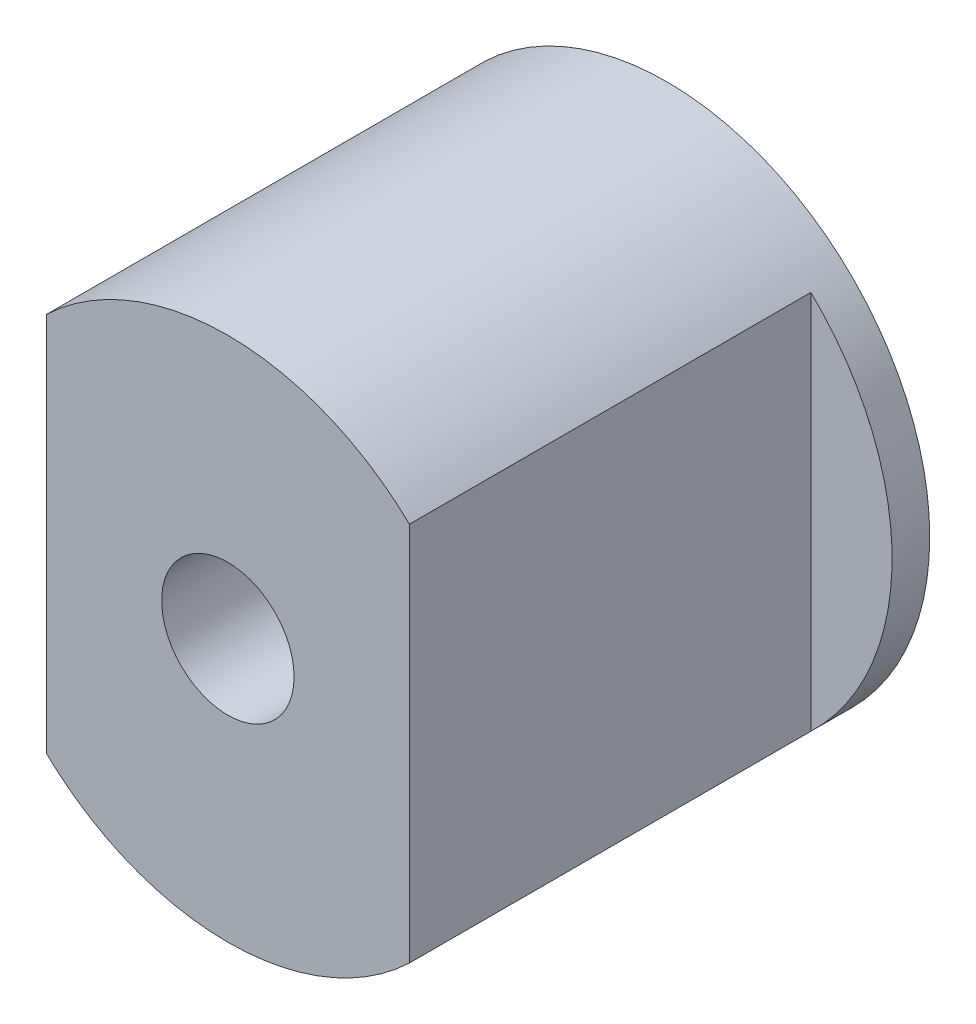
ISO-10303-21;
HEADER;
FILE_DESCRIPTION(('STEP AP214'),'2;1');
FILE_NAME('part.step','',(''),(''),'','','');
FILE_SCHEMA(('AUTOMOTIVE_DESIGN { 1 0 10303 214 1 1 1 1 }'));
ENDSEC;
DATA;
#1=APPLICATION_CONTEXT('core data for automotive mechanical design processes');
#2=APPLICATION_PROTOCOL_DEFINITION('international standard','automotive_design',2000,#1);
#3=PRODUCT_CONTEXT('',#1,'mechanical');
#4=PRODUCT('Part','Part','',(#3));
#5=PRODUCT_RELATED_PRODUCT_CATEGORY('part','',(#4));
#6=PRODUCT_DEFINITION_FORMATION('','',#4);
#7=PRODUCT_DEFINITION_CONTEXT('part definition',#1,'design');
#8=PRODUCT_DEFINITION('design','',#6,#7);
#9=PRODUCT_DEFINITION_SHAPE('','',#8);
#10=(LENGTH_UNIT() NAMED_UNIT(*) SI_UNIT(.MILLI.,.METRE.));
#11=(NAMED_UNIT(*) PLANE_ANGLE_UNIT() SI_UNIT($,.RADIAN.));
#12=(NAMED_UNIT(*) SI_UNIT($,.STERADIAN.) SOLID_ANGLE_UNIT());
#13=UNCERTAINTY_MEASURE_WITH_UNIT(LENGTH_MEASURE(1.E-05),#10,'distance_accuracy_value','');
#14=(GEOMETRIC_REPRESENTATION_CONTEXT(3) GLOBAL_UNCERTAINTY_ASSIGNED_CONTEXT((#13)) GLOBAL_UNIT_ASSIGNED_CONTEXT((#10,
#11,#12)) REPRESENTATION_CONTEXT('',''));
#15=CARTESIAN_POINT('',(0.,0.,0.));
#16=DIRECTION('',(0.,0.,1.));
#17=DIRECTION('',(1.,0.,0.));
#18=AXIS2_PLACEMENT_3D('',#15,#16,#17);
#19=CARTESIAN_POINT('',(0.,0.,0.5));
#20=DIRECTION('',(0.,0.,1.));
#21=DIRECTION('',(1.,0.,0.));
#22=AXIS2_PLACEMENT_3D('',#19,#20,#21);
#23=PLANE('',#22);
#24=DIRECTION('',(0.,-1.,0.));
#25=VECTOR('',#24,1.);
#26=CARTESIAN_POINT('',(-2.413,-2.52487370971302,0.5));
#27=LINE('',#26,#25);
#28=CARTESIAN_POINT('',(-2.413,2.52487370971302,0.5));
#29=VERTEX_POINT('',#28);
#30=CARTESIAN_POINT('',(-2.413,-2.52487370971302,0.5));
#31=VERTEX_POINT('',#30);
#32=EDGE_CURVE('E84',#29,#31,#27,.T.);
#33=ORIENTED_EDGE('',*,*,#32,.F.);
#34=CARTESIAN_POINT('',(0.,0.,0.5));
#35=DIRECTION('',(0.,0.,1.));
#36=DIRECTION('',(1.,0.,0.));
#37=AXIS2_PLACEMENT_3D('',#34,#35,#36);
#38=CIRCLE('',#37,3.4925);
#39=EDGE_CURVE('E11',#29,#31,#38,.T.);
#40=ORIENTED_EDGE('',*,*,#39,.T.);
#41=EDGE_LOOP('',(#33,#40));
#42=FACE_BOUND('',#41,.T.);
#43=ADVANCED_FACE('F33',(#42),#23,.T.);
#44=CARTESIAN_POINT('',(0.,0.,0.5));
#45=DIRECTION('',(0.,0.,-1.));
#46=DIRECTION('',(-1.,0.,0.));
#47=AXIS2_PLACEMENT_3D('',#44,#45,#46);
#48=CYLINDRICAL_SURFACE('',#47,3.4925);
#49=ORIENTED_EDGE('',*,*,#39,.F.);
#50=DIRECTION('',(0.,0.,-1.));
#51=VECTOR('',#50,1.);
#52=CARTESIAN_POINT('',(-2.413,2.52487370971302,5.834));
#53=LINE('',#52,#51);
#54=CARTESIAN_POINT('',(-2.413,2.52487370971302,5.834));
#55=VERTEX_POINT('',#54);
#56=EDGE_CURVE('E90',#55,#29,#53,.T.);
#57=ORIENTED_EDGE('',*,*,#56,.F.);
#58=CARTESIAN_POINT('',(0.,0.,5.834));
#59=DIRECTION('',(0.,0.,1.));
#60=DIRECTION('',(1.,0.,0.));
#61=AXIS2_PLACEMENT_3D('',#58,#59,#60);
#62=CIRCLE('',#61,3.4925);
#63=CARTESIAN_POINT('',(2.413,2.52487370971302,5.834));
#64=VERTEX_POINT('',#63);
#65=EDGE_CURVE('E89',#64,#55,#62,.T.);
#66=ORIENTED_EDGE('',*,*,#65,.F.);
#67=DIRECTION('',(0.,0.,-1.));
#68=VECTOR('',#67,1.);
#69=CARTESIAN_POINT('',(2.413,2.52487370971302,5.834));
#70=LINE('',#69,#68);
#71=CARTESIAN_POINT('',(2.413,2.52487370971302,0.5));
#72=VERTEX_POINT('',#71);
#73=EDGE_CURVE('E81',#64,#72,#70,.T.);
#74=ORIENTED_EDGE('',*,*,#73,.T.);
#75=CARTESIAN_POINT('',(2.413,-2.52487370971302,0.5));
#76=VERTEX_POINT('',#75);
#77=EDGE_CURVE('E42',#76,#72,#38,.T.);
#78=ORIENTED_EDGE('',*,*,#77,.F.);
#79=DIRECTION('',(0.,0.,-1.));
#80=VECTOR('',#79,1.);
#81=CARTESIAN_POINT('',(2.413,-2.52487370971302,5.834));
#82=LINE('',#81,#80);
#83=CARTESIAN_POINT('',(2.413,-2.52487370971302,5.834));
#84=VERTEX_POINT('',#83);
#85=EDGE_CURVE('E83',#84,#76,#82,.T.);
#86=ORIENTED_EDGE('',*,*,#85,.F.);
#87=CARTESIAN_POINT('',(0.,0.,5.834));
#88=DIRECTION('',(0.,0.,1.));
#89=DIRECTION('',(1.,0.,0.));
#90=AXIS2_PLACEMENT_3D('',#87,#88,#89);
#91=CIRCLE('',#90,3.4925);
#92=CARTESIAN_POINT('',(-2.413,-2.52487370971302,5.834));
#93=VERTEX_POINT('',#92);
#94=EDGE_CURVE('E103',#93,#84,#91,.T.);
#95=ORIENTED_EDGE('',*,*,#94,.F.);
#96=DIRECTION('',(0.,0.,-1.));
#97=VECTOR('',#96,1.);
#98=CARTESIAN_POINT('',(-2.413,-2.52487370971302,5.834));
#99=LINE('',#98,#97);
#100=EDGE_CURVE('E94',#93,#31,#99,.T.);
#101=ORIENTED_EDGE('',*,*,#100,.T.);
#102=EDGE_LOOP('',(#49,#57,#66,#74,#78,#86,#95,#101));
#103=FACE_BOUND('',#102,.T.);
#104=CARTESIAN_POINT('',(0.,0.,0.));
#105=DIRECTION('',(0.,0.,1.));
#106=DIRECTION('',(1.,0.,0.));
#107=AXIS2_PLACEMENT_3D('',#104,#105,#106);
#108=CIRCLE('',#107,3.4925);
#109=CARTESIAN_POINT('',(3.4925,0.,0.));
#110=VERTEX_POINT('',#109);
#111=EDGE_CURVE('E76',#110,#110,#108,.T.);
#112=ORIENTED_EDGE('',*,*,#111,.T.);
#113=EDGE_LOOP('',(#112));
#114=FACE_BOUND('',#113,.T.);
#115=ADVANCED_FACE('F35',(#103,#114),#48,.T.);
#116=DIRECTION('',(0.,1.,0.));
#117=VECTOR('',#116,1.);
#118=CARTESIAN_POINT('',(2.413,-2.52487370971302,0.5));
#119=LINE('',#118,#117);
#120=EDGE_CURVE('E49',#76,#72,#119,.T.);
#121=ORIENTED_EDGE('',*,*,#120,.F.);
#122=ORIENTED_EDGE('',*,*,#77,.T.);
#123=EDGE_LOOP('',(#121,#122));
#124=FACE_BOUND('',#123,.T.);
#125=ADVANCED_FACE('F71',(#124),#23,.T.);
#126=CARTESIAN_POINT('',(0.,0.,0.));
#127=DIRECTION('',(0.,0.,1.));
#128=DIRECTION('',(1.,0.,0.));
#129=AXIS2_PLACEMENT_3D('',#126,#127,#128);
#130=PLANE('',#129);
#131=CARTESIAN_POINT('',(0.,0.,0.));
#132=DIRECTION('',(0.,0.,1.));
#133=DIRECTION('',(1.,0.,0.));
#134=AXIS2_PLACEMENT_3D('',#131,#132,#133);
#135=CIRCLE('',#134,0.88);
#136=CARTESIAN_POINT('',(0.88,0.,0.));
#137=VERTEX_POINT('',#136);
#138=EDGE_CURVE('E85',#137,#137,#135,.F.);
#139=ORIENTED_EDGE('',*,*,#138,.F.);
#140=EDGE_LOOP('',(#139));
#141=FACE_BOUND('',#140,.T.);
#142=ORIENTED_EDGE('',*,*,#111,.F.);
#143=EDGE_LOOP('',(#142));
#144=FACE_BOUND('',#143,.T.);
#145=ADVANCED_FACE('F122',(#141,#144),#130,.F.);
#146=CARTESIAN_POINT('',(2.413,-2.52487370971302,5.834));
#147=DIRECTION('',(-1.,0.,0.));
#148=DIRECTION('',(0.,0.,1.));
#149=AXIS2_PLACEMENT_3D('',#146,#147,#148);
#150=PLANE('',#149);
#151=ORIENTED_EDGE('',*,*,#120,.T.);
#152=ORIENTED_EDGE('',*,*,#73,.F.);
#153=DIRECTION('',(0.,1.,0.));
#154=VECTOR('',#153,1.);
#155=CARTESIAN_POINT('',(2.413,-2.52487370971302,5.834));
#156=LINE('',#155,#154);
#157=EDGE_CURVE('E111',#84,#64,#156,.T.);
#158=ORIENTED_EDGE('',*,*,#157,.F.);
#159=ORIENTED_EDGE('',*,*,#85,.T.);
#160=EDGE_LOOP('',(#151,#152,#158,#159));
#161=FACE_BOUND('',#160,.T.);
#162=ADVANCED_FACE('F80',(#161),#150,.F.);
#163=CARTESIAN_POINT('',(-2.413,-2.52487370971302,5.834));
#164=DIRECTION('',(1.,0.,0.));
#165=DIRECTION('',(0.,0.,-1.));
#166=AXIS2_PLACEMENT_3D('',#163,#164,#165);
#167=PLANE('',#166);
#168=ORIENTED_EDGE('',*,*,#32,.T.);
#169=ORIENTED_EDGE('',*,*,#100,.F.);
#170=DIRECTION('',(0.,-1.,0.));
#171=VECTOR('',#170,1.);
#172=CARTESIAN_POINT('',(-2.413,-2.52487370971302,5.834));
#173=LINE('',#172,#171);
#174=EDGE_CURVE('E114',#55,#93,#173,.T.);
#175=ORIENTED_EDGE('',*,*,#174,.F.);
#176=ORIENTED_EDGE('',*,*,#56,.T.);
#177=EDGE_LOOP('',(#168,#169,#175,#176));
#178=FACE_BOUND('',#177,.T.);
#179=ADVANCED_FACE('F130',(#178),#167,.F.);
#180=CARTESIAN_POINT('',(0.,0.,5.834));
#181=DIRECTION('',(0.,0.,1.));
#182=DIRECTION('',(1.,0.,0.));
#183=AXIS2_PLACEMENT_3D('',#180,#181,#182);
#184=PLANE('',#183);
#185=CARTESIAN_POINT('',(0.,0.,5.834));
#186=DIRECTION('',(0.,0.,1.));
#187=DIRECTION('',(1.,0.,0.));
#188=AXIS2_PLACEMENT_3D('',#185,#186,#187);
#189=CIRCLE('',#188,0.88);
#190=CARTESIAN_POINT('',(0.88,0.,5.834));
#191=VERTEX_POINT('',#190);
#192=EDGE_CURVE('E157',#191,#191,#189,.T.);
#193=ORIENTED_EDGE('',*,*,#192,.F.);
#194=EDGE_LOOP('',(#193));
#195=FACE_BOUND('',#194,.T.);
#196=ORIENTED_EDGE('',*,*,#94,.T.);
#197=ORIENTED_EDGE('',*,*,#157,.T.);
#198=ORIENTED_EDGE('',*,*,#65,.T.);
#199=ORIENTED_EDGE('',*,*,#174,.T.);
#200=EDGE_LOOP('',(#196,#197,#198,#199));
#201=FACE_BOUND('',#200,.T.);
#202=ADVANCED_FACE('F143',(#195,#201),#184,.T.);
#203=CARTESIAN_POINT('',(0.,0.,-2.48901586977665));
#204=DIRECTION('',(0.,0.,1.));
#205=DIRECTION('',(1.,0.,0.));
#206=AXIS2_PLACEMENT_3D('',#203,#204,#205);
#207=CYLINDRICAL_SURFACE('',#206,0.88);
#208=ORIENTED_EDGE('',*,*,#138,.T.);
#209=EDGE_LOOP('',(#208));
#210=FACE_BOUND('',#209,.T.);
#211=ORIENTED_EDGE('',*,*,#192,.T.);
#212=EDGE_LOOP('',(#211));
#213=FACE_BOUND('',#212,.T.);
#214=ADVANCED_FACE('F145',(#210,#213),#207,.F.);
#215=CLOSED_SHELL('',(#43,#115,#125,#145,#162,#179,#202,#214));
#216=MANIFOLD_SOLID_BREP('B2',#215);
#217=ADVANCED_BREP_SHAPE_REPRESENTATION('',(#18,#216),#14);
#218=SHAPE_DEFINITION_REPRESENTATION(#9,#217);
ENDSEC;
END-ISO-10303-21;
